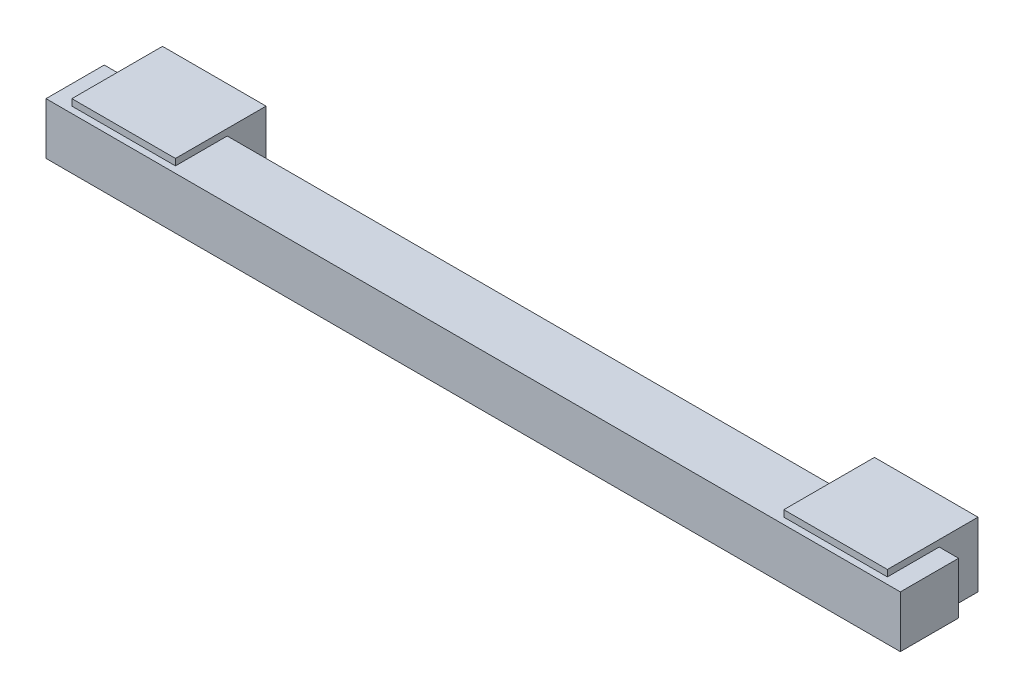
ISO-10303-21;
HEADER;
FILE_DESCRIPTION(('STEP AP214'),'2;1');
FILE_NAME('part.step','',(''),(''),'','','');
FILE_SCHEMA(('AUTOMOTIVE_DESIGN { 1 0 10303 214 1 1 1 1 }'));
ENDSEC;
DATA;
#1=APPLICATION_CONTEXT('core data for automotive mechanical design processes');
#2=APPLICATION_PROTOCOL_DEFINITION('international standard','automotive_design',2000,#1);
#3=PRODUCT_CONTEXT('',#1,'mechanical');
#4=PRODUCT('Part','Part','',(#3));
#5=PRODUCT_RELATED_PRODUCT_CATEGORY('part','',(#4));
#6=PRODUCT_DEFINITION_FORMATION('','',#4);
#7=PRODUCT_DEFINITION_CONTEXT('part definition',#1,'design');
#8=PRODUCT_DEFINITION('design','',#6,#7);
#9=PRODUCT_DEFINITION_SHAPE('','',#8);
#10=(LENGTH_UNIT() NAMED_UNIT(*) SI_UNIT(.MILLI.,.METRE.));
#11=(NAMED_UNIT(*) PLANE_ANGLE_UNIT() SI_UNIT($,.RADIAN.));
#12=(NAMED_UNIT(*) SI_UNIT($,.STERADIAN.) SOLID_ANGLE_UNIT());
#13=UNCERTAINTY_MEASURE_WITH_UNIT(LENGTH_MEASURE(1.E-05),#10,'distance_accuracy_value','');
#14=(GEOMETRIC_REPRESENTATION_CONTEXT(3) GLOBAL_UNCERTAINTY_ASSIGNED_CONTEXT((#13)) GLOBAL_UNIT_ASSIGNED_CONTEXT((#10,
#11,#12)) REPRESENTATION_CONTEXT('',''));
#15=CARTESIAN_POINT('',(0.,0.,0.));
#16=DIRECTION('',(0.,0.,1.));
#17=DIRECTION('',(1.,0.,0.));
#18=AXIS2_PLACEMENT_3D('',#15,#16,#17);
#19=CARTESIAN_POINT('',(0.,0.,15.));
#20=DIRECTION('',(0.,0.,1.));
#21=DIRECTION('',(1.,0.,0.));
#22=AXIS2_PLACEMENT_3D('',#19,#20,#21);
#23=PLANE('',#22);
#24=DIRECTION('',(-1.,0.,0.));
#25=VECTOR('',#24,1.);
#26=CARTESIAN_POINT('',(0.,-4.,15.));
#27=LINE('',#26,#25);
#28=CARTESIAN_POINT('',(66.,-4.,15.));
#29=VERTEX_POINT('',#28);
#30=CARTESIAN_POINT('',(-66.,-4.,15.));
#31=VERTEX_POINT('',#30);
#32=EDGE_CURVE('P0_E11',#29,#31,#27,.T.);
#33=ORIENTED_EDGE('',*,*,#32,.F.);
#34=DIRECTION('',(0.,-1.,0.));
#35=VECTOR('',#34,1.);
#36=CARTESIAN_POINT('',(66.,0.,15.));
#37=LINE('',#36,#35);
#38=CARTESIAN_POINT('',(66.,4.,15.));
#39=VERTEX_POINT('',#38);
#40=EDGE_CURVE('P0_E62',#39,#29,#37,.T.);
#41=ORIENTED_EDGE('',*,*,#40,.F.);
#42=DIRECTION('',(1.,0.,0.));
#43=VECTOR('',#42,1.);
#44=CARTESIAN_POINT('',(0.,4.,15.));
#45=LINE('',#44,#43);
#46=CARTESIAN_POINT('',(-66.,4.,15.));
#47=VERTEX_POINT('',#46);
#48=EDGE_CURVE('P0_E98',#47,#39,#45,.T.);
#49=ORIENTED_EDGE('',*,*,#48,.F.);
#50=DIRECTION('',(0.,1.,0.));
#51=VECTOR('',#50,1.);
#52=CARTESIAN_POINT('',(-66.,0.,15.));
#53=LINE('',#52,#51);
#54=EDGE_CURVE('P0_E25',#31,#47,#53,.T.);
#55=ORIENTED_EDGE('',*,*,#54,.F.);
#56=EDGE_LOOP('',(#33,#41,#49,#55));
#57=FACE_BOUND('',#56,.T.);
#58=ADVANCED_FACE('P0_F17',(#57),#23,.T.);
#59=CARTESIAN_POINT('',(0.,-4.,6.));
#60=DIRECTION('',(0.,-1.,0.));
#61=DIRECTION('',(0.,0.,-1.));
#62=AXIS2_PLACEMENT_3D('',#59,#60,#61);
#63=PLANE('',#62);
#64=DIRECTION('',(0.,0.,1.));
#65=VECTOR('',#64,1.);
#66=CARTESIAN_POINT('',(66.,-4.,6.));
#67=LINE('',#66,#65);
#68=CARTESIAN_POINT('',(66.,-4.,6.));
#69=VERTEX_POINT('',#68);
#70=EDGE_CURVE('P0_E55',#69,#29,#67,.T.);
#71=ORIENTED_EDGE('',*,*,#70,.T.);
#72=ORIENTED_EDGE('',*,*,#32,.T.);
#73=DIRECTION('',(0.,0.,1.));
#74=VECTOR('',#73,1.);
#75=CARTESIAN_POINT('',(-66.,-4.,6.));
#76=LINE('',#75,#74);
#77=CARTESIAN_POINT('',(-66.,-4.,6.));
#78=VERTEX_POINT('',#77);
#79=EDGE_CURVE('P0_E69',#78,#31,#76,.T.);
#80=ORIENTED_EDGE('',*,*,#79,.F.);
#81=DIRECTION('',(1.,0.,0.));
#82=VECTOR('',#81,1.);
#83=CARTESIAN_POINT('',(0.,-4.,6.));
#84=LINE('',#83,#82);
#85=EDGE_CURVE('P0_E67',#78,#69,#84,.T.);
#86=ORIENTED_EDGE('',*,*,#85,.T.);
#87=EDGE_LOOP('',(#71,#72,#80,#86));
#88=FACE_BOUND('',#87,.T.);
#89=ADVANCED_FACE('P0_F68',(#88),#63,.T.);
#90=CARTESIAN_POINT('',(-66.,0.,6.));
#91=DIRECTION('',(-1.,0.,0.));
#92=DIRECTION('',(0.,0.,1.));
#93=AXIS2_PLACEMENT_3D('',#90,#91,#92);
#94=PLANE('',#93);
#95=ORIENTED_EDGE('',*,*,#79,.T.);
#96=ORIENTED_EDGE('',*,*,#54,.T.);
#97=DIRECTION('',(0.,0.,1.));
#98=VECTOR('',#97,1.);
#99=CARTESIAN_POINT('',(-66.,4.,6.));
#100=LINE('',#99,#98);
#101=CARTESIAN_POINT('',(-66.,4.,6.));
#102=VERTEX_POINT('',#101);
#103=EDGE_CURVE('P0_E92',#102,#47,#100,.T.);
#104=ORIENTED_EDGE('',*,*,#103,.F.);
#105=DIRECTION('',(0.,-1.,0.));
#106=VECTOR('',#105,1.);
#107=CARTESIAN_POINT('',(-66.,0.,6.));
#108=LINE('',#107,#106);
#109=EDGE_CURVE('P0_E74',#102,#78,#108,.T.);
#110=ORIENTED_EDGE('',*,*,#109,.T.);
#111=EDGE_LOOP('',(#95,#96,#104,#110));
#112=FACE_BOUND('',#111,.T.);
#113=ADVANCED_FACE('P0_F106',(#112),#94,.T.);
#114=CARTESIAN_POINT('',(0.,4.,6.));
#115=DIRECTION('',(0.,1.,0.));
#116=DIRECTION('',(0.,0.,1.));
#117=AXIS2_PLACEMENT_3D('',#114,#115,#116);
#118=PLANE('',#117);
#119=ORIENTED_EDGE('',*,*,#103,.T.);
#120=ORIENTED_EDGE('',*,*,#48,.T.);
#121=DIRECTION('',(0.,0.,1.));
#122=VECTOR('',#121,1.);
#123=CARTESIAN_POINT('',(66.,4.,6.));
#124=LINE('',#123,#122);
#125=CARTESIAN_POINT('',(66.,4.,6.));
#126=VERTEX_POINT('',#125);
#127=EDGE_CURVE('P0_E64',#126,#39,#124,.T.);
#128=ORIENTED_EDGE('',*,*,#127,.F.);
#129=DIRECTION('',(-1.,0.,0.));
#130=VECTOR('',#129,1.);
#131=CARTESIAN_POINT('',(0.,4.,6.));
#132=LINE('',#131,#130);
#133=EDGE_CURVE('P0_E79',#126,#102,#132,.T.);
#134=ORIENTED_EDGE('',*,*,#133,.T.);
#135=EDGE_LOOP('',(#119,#120,#128,#134));
#136=FACE_BOUND('',#135,.T.);
#137=ADVANCED_FACE('P0_F104',(#136),#118,.T.);
#138=CARTESIAN_POINT('',(0.,0.,6.));
#139=DIRECTION('',(0.,0.,-1.));
#140=DIRECTION('',(-1.,0.,0.));
#141=AXIS2_PLACEMENT_3D('',#138,#139,#140);
#142=PLANE('',#141);
#143=DIRECTION('',(0.,1.,0.));
#144=VECTOR('',#143,1.);
#145=CARTESIAN_POINT('',(66.,0.,6.));
#146=LINE('',#145,#144);
#147=EDGE_CURVE('P0_E60',#69,#126,#146,.T.);
#148=ORIENTED_EDGE('',*,*,#147,.F.);
#149=ORIENTED_EDGE('',*,*,#85,.F.);
#150=ORIENTED_EDGE('',*,*,#109,.F.);
#151=ORIENTED_EDGE('',*,*,#133,.F.);
#152=EDGE_LOOP('',(#148,#149,#150,#151));
#153=FACE_BOUND('',#152,.T.);
#154=ADVANCED_FACE('P0_F77',(#153),#142,.T.);
#155=CARTESIAN_POINT('',(66.,0.,6.));
#156=DIRECTION('',(1.,0.,0.));
#157=DIRECTION('',(0.,0.,-1.));
#158=AXIS2_PLACEMENT_3D('',#155,#156,#157);
#159=PLANE('',#158);
#160=ORIENTED_EDGE('',*,*,#147,.T.);
#161=ORIENTED_EDGE('',*,*,#127,.T.);
#162=ORIENTED_EDGE('',*,*,#40,.T.);
#163=ORIENTED_EDGE('',*,*,#70,.F.);
#164=EDGE_LOOP('',(#160,#161,#162,#163));
#165=FACE_BOUND('',#164,.T.);
#166=ADVANCED_FACE('P0_F57',(#165),#159,.T.);
#167=CLOSED_SHELL('',(#58,#89,#113,#137,#154,#166));
#168=MANIFOLD_SOLID_BREP('P0_B1',#167);
#169=CARTESIAN_POINT('',(-55.,0.,14.));
#170=DIRECTION('',(0.,0.,1.));
#171=DIRECTION('',(1.,0.,0.));
#172=AXIS2_PLACEMENT_3D('',#169,#170,#171);
#173=PLANE('',#172);
#174=DIRECTION('',(-1.,0.,0.));
#175=VECTOR('',#174,1.);
#176=CARTESIAN_POINT('',(-55.,-5.,14.));
#177=LINE('',#176,#175);
#178=CARTESIAN_POINT('',(-47.,-5.,14.));
#179=VERTEX_POINT('',#178);
#180=CARTESIAN_POINT('',(-63.,-5.,14.));
#181=VERTEX_POINT('',#180);
#182=EDGE_CURVE('P1_E11',#179,#181,#177,.T.);
#183=ORIENTED_EDGE('',*,*,#182,.F.);
#184=DIRECTION('',(0.,-1.,0.));
#185=VECTOR('',#184,1.);
#186=CARTESIAN_POINT('',(-47.,0.,14.));
#187=LINE('',#186,#185);
#188=CARTESIAN_POINT('',(-47.,5.,14.));
#189=VERTEX_POINT('',#188);
#190=EDGE_CURVE('P1_E62',#189,#179,#187,.T.);
#191=ORIENTED_EDGE('',*,*,#190,.F.);
#192=DIRECTION('',(1.,0.,0.));
#193=VECTOR('',#192,1.);
#194=CARTESIAN_POINT('',(-55.,5.,14.));
#195=LINE('',#194,#193);
#196=CARTESIAN_POINT('',(-63.,5.,14.));
#197=VERTEX_POINT('',#196);
#198=EDGE_CURVE('P1_E98',#197,#189,#195,.T.);
#199=ORIENTED_EDGE('',*,*,#198,.F.);
#200=DIRECTION('',(0.,1.,0.));
#201=VECTOR('',#200,1.);
#202=CARTESIAN_POINT('',(-63.,0.,14.));
#203=LINE('',#202,#201);
#204=EDGE_CURVE('P1_E25',#181,#197,#203,.T.);
#205=ORIENTED_EDGE('',*,*,#204,.F.);
#206=EDGE_LOOP('',(#183,#191,#199,#205));
#207=FACE_BOUND('',#206,.T.);
#208=ADVANCED_FACE('P1_F17',(#207),#173,.T.);
#209=CARTESIAN_POINT('',(-55.,-5.,0.));
#210=DIRECTION('',(0.,-1.,0.));
#211=DIRECTION('',(0.,0.,-1.));
#212=AXIS2_PLACEMENT_3D('',#209,#210,#211);
#213=PLANE('',#212);
#214=DIRECTION('',(0.,0.,1.));
#215=VECTOR('',#214,1.);
#216=CARTESIAN_POINT('',(-47.,-5.,0.));
#217=LINE('',#216,#215);
#218=CARTESIAN_POINT('',(-47.,-5.,0.));
#219=VERTEX_POINT('',#218);
#220=EDGE_CURVE('P1_E55',#219,#179,#217,.T.);
#221=ORIENTED_EDGE('',*,*,#220,.T.);
#222=ORIENTED_EDGE('',*,*,#182,.T.);
#223=DIRECTION('',(0.,0.,1.));
#224=VECTOR('',#223,1.);
#225=CARTESIAN_POINT('',(-63.,-5.,0.));
#226=LINE('',#225,#224);
#227=CARTESIAN_POINT('',(-63.,-5.,0.));
#228=VERTEX_POINT('',#227);
#229=EDGE_CURVE('P1_E69',#228,#181,#226,.T.);
#230=ORIENTED_EDGE('',*,*,#229,.F.);
#231=DIRECTION('',(1.,0.,0.));
#232=VECTOR('',#231,1.);
#233=CARTESIAN_POINT('',(-55.,-5.,0.));
#234=LINE('',#233,#232);
#235=EDGE_CURVE('P1_E67',#228,#219,#234,.T.);
#236=ORIENTED_EDGE('',*,*,#235,.T.);
#237=EDGE_LOOP('',(#221,#222,#230,#236));
#238=FACE_BOUND('',#237,.T.);
#239=ADVANCED_FACE('P1_F68',(#238),#213,.T.);
#240=CARTESIAN_POINT('',(-63.,0.,0.));
#241=DIRECTION('',(-1.,0.,0.));
#242=DIRECTION('',(0.,0.,1.));
#243=AXIS2_PLACEMENT_3D('',#240,#241,#242);
#244=PLANE('',#243);
#245=ORIENTED_EDGE('',*,*,#229,.T.);
#246=ORIENTED_EDGE('',*,*,#204,.T.);
#247=DIRECTION('',(0.,0.,1.));
#248=VECTOR('',#247,1.);
#249=CARTESIAN_POINT('',(-63.,5.,0.));
#250=LINE('',#249,#248);
#251=CARTESIAN_POINT('',(-63.,5.,0.));
#252=VERTEX_POINT('',#251);
#253=EDGE_CURVE('P1_E91',#252,#197,#250,.T.);
#254=ORIENTED_EDGE('',*,*,#253,.F.);
#255=DIRECTION('',(0.,-1.,0.));
#256=VECTOR('',#255,1.);
#257=CARTESIAN_POINT('',(-63.,0.,0.));
#258=LINE('',#257,#256);
#259=EDGE_CURVE('P1_E74',#252,#228,#258,.T.);
#260=ORIENTED_EDGE('',*,*,#259,.T.);
#261=EDGE_LOOP('',(#245,#246,#254,#260));
#262=FACE_BOUND('',#261,.T.);
#263=ADVANCED_FACE('P1_F106',(#262),#244,.T.);
#264=CARTESIAN_POINT('',(-55.,5.,0.));
#265=DIRECTION('',(0.,1.,0.));
#266=DIRECTION('',(0.,0.,1.));
#267=AXIS2_PLACEMENT_3D('',#264,#265,#266);
#268=PLANE('',#267);
#269=ORIENTED_EDGE('',*,*,#253,.T.);
#270=ORIENTED_EDGE('',*,*,#198,.T.);
#271=DIRECTION('',(0.,0.,1.));
#272=VECTOR('',#271,1.);
#273=CARTESIAN_POINT('',(-47.,5.,0.));
#274=LINE('',#273,#272);
#275=CARTESIAN_POINT('',(-47.,5.,0.));
#276=VERTEX_POINT('',#275);
#277=EDGE_CURVE('P1_E64',#276,#189,#274,.T.);
#278=ORIENTED_EDGE('',*,*,#277,.F.);
#279=DIRECTION('',(-1.,0.,0.));
#280=VECTOR('',#279,1.);
#281=CARTESIAN_POINT('',(-55.,5.,0.));
#282=LINE('',#281,#280);
#283=EDGE_CURVE('P1_E79',#276,#252,#282,.T.);
#284=ORIENTED_EDGE('',*,*,#283,.T.);
#285=EDGE_LOOP('',(#269,#270,#278,#284));
#286=FACE_BOUND('',#285,.T.);
#287=ADVANCED_FACE('P1_F104',(#286),#268,.T.);
#288=CARTESIAN_POINT('',(-55.,0.,0.));
#289=DIRECTION('',(0.,0.,-1.));
#290=DIRECTION('',(-1.,0.,0.));
#291=AXIS2_PLACEMENT_3D('',#288,#289,#290);
#292=PLANE('',#291);
#293=DIRECTION('',(0.,1.,0.));
#294=VECTOR('',#293,1.);
#295=CARTESIAN_POINT('',(-47.,0.,0.));
#296=LINE('',#295,#294);
#297=EDGE_CURVE('P1_E60',#219,#276,#296,.T.);
#298=ORIENTED_EDGE('',*,*,#297,.F.);
#299=ORIENTED_EDGE('',*,*,#235,.F.);
#300=ORIENTED_EDGE('',*,*,#259,.F.);
#301=ORIENTED_EDGE('',*,*,#283,.F.);
#302=EDGE_LOOP('',(#298,#299,#300,#301));
#303=FACE_BOUND('',#302,.T.);
#304=ADVANCED_FACE('P1_F77',(#303),#292,.T.);
#305=CARTESIAN_POINT('',(-47.,0.,0.));
#306=DIRECTION('',(1.,0.,0.));
#307=DIRECTION('',(0.,0.,-1.));
#308=AXIS2_PLACEMENT_3D('',#305,#306,#307);
#309=PLANE('',#308);
#310=ORIENTED_EDGE('',*,*,#297,.T.);
#311=ORIENTED_EDGE('',*,*,#277,.T.);
#312=ORIENTED_EDGE('',*,*,#190,.T.);
#313=ORIENTED_EDGE('',*,*,#220,.F.);
#314=EDGE_LOOP('',(#310,#311,#312,#313));
#315=FACE_BOUND('',#314,.T.);
#316=ADVANCED_FACE('P1_F57',(#315),#309,.T.);
#317=CLOSED_SHELL('',(#208,#239,#263,#287,#304,#316));
#318=MANIFOLD_SOLID_BREP('P1_B1',#317);
#319=CARTESIAN_POINT('',(55.,0.,14.));
#320=DIRECTION('',(0.,0.,1.));
#321=DIRECTION('',(1.,0.,0.));
#322=AXIS2_PLACEMENT_3D('',#319,#320,#321);
#323=PLANE('',#322);
#324=DIRECTION('',(-1.,0.,0.));
#325=VECTOR('',#324,1.);
#326=CARTESIAN_POINT('',(55.,-5.,14.));
#327=LINE('',#326,#325);
#328=CARTESIAN_POINT('',(63.,-5.,14.));
#329=VERTEX_POINT('',#328);
#330=CARTESIAN_POINT('',(47.,-5.,14.));
#331=VERTEX_POINT('',#330);
#332=EDGE_CURVE('P2_E11',#329,#331,#327,.T.);
#333=ORIENTED_EDGE('',*,*,#332,.F.);
#334=DIRECTION('',(0.,-1.,0.));
#335=VECTOR('',#334,1.);
#336=CARTESIAN_POINT('',(63.,0.,14.));
#337=LINE('',#336,#335);
#338=CARTESIAN_POINT('',(63.,5.,14.));
#339=VERTEX_POINT('',#338);
#340=EDGE_CURVE('P2_E62',#339,#329,#337,.T.);
#341=ORIENTED_EDGE('',*,*,#340,.F.);
#342=DIRECTION('',(1.,0.,0.));
#343=VECTOR('',#342,1.);
#344=CARTESIAN_POINT('',(55.,5.,14.));
#345=LINE('',#344,#343);
#346=CARTESIAN_POINT('',(47.,5.,14.));
#347=VERTEX_POINT('',#346);
#348=EDGE_CURVE('P2_E98',#347,#339,#345,.T.);
#349=ORIENTED_EDGE('',*,*,#348,.F.);
#350=DIRECTION('',(0.,1.,0.));
#351=VECTOR('',#350,1.);
#352=CARTESIAN_POINT('',(47.,0.,14.));
#353=LINE('',#352,#351);
#354=EDGE_CURVE('P2_E25',#331,#347,#353,.T.);
#355=ORIENTED_EDGE('',*,*,#354,.F.);
#356=EDGE_LOOP('',(#333,#341,#349,#355));
#357=FACE_BOUND('',#356,.T.);
#358=ADVANCED_FACE('P2_F17',(#357),#323,.T.);
#359=CARTESIAN_POINT('',(55.,-5.,0.));
#360=DIRECTION('',(0.,-1.,0.));
#361=DIRECTION('',(0.,0.,-1.));
#362=AXIS2_PLACEMENT_3D('',#359,#360,#361);
#363=PLANE('',#362);
#364=DIRECTION('',(0.,0.,1.));
#365=VECTOR('',#364,1.);
#366=CARTESIAN_POINT('',(63.,-5.,0.));
#367=LINE('',#366,#365);
#368=CARTESIAN_POINT('',(63.,-5.,0.));
#369=VERTEX_POINT('',#368);
#370=EDGE_CURVE('P2_E55',#369,#329,#367,.T.);
#371=ORIENTED_EDGE('',*,*,#370,.T.);
#372=ORIENTED_EDGE('',*,*,#332,.T.);
#373=DIRECTION('',(0.,0.,1.));
#374=VECTOR('',#373,1.);
#375=CARTESIAN_POINT('',(47.,-5.,0.));
#376=LINE('',#375,#374);
#377=CARTESIAN_POINT('',(47.,-5.,0.));
#378=VERTEX_POINT('',#377);
#379=EDGE_CURVE('P2_E69',#378,#331,#376,.T.);
#380=ORIENTED_EDGE('',*,*,#379,.F.);
#381=DIRECTION('',(1.,0.,0.));
#382=VECTOR('',#381,1.);
#383=CARTESIAN_POINT('',(55.,-5.,0.));
#384=LINE('',#383,#382);
#385=EDGE_CURVE('P2_E67',#378,#369,#384,.T.);
#386=ORIENTED_EDGE('',*,*,#385,.T.);
#387=EDGE_LOOP('',(#371,#372,#380,#386));
#388=FACE_BOUND('',#387,.T.);
#389=ADVANCED_FACE('P2_F68',(#388),#363,.T.);
#390=CARTESIAN_POINT('',(47.,0.,0.));
#391=DIRECTION('',(-1.,0.,0.));
#392=DIRECTION('',(0.,0.,1.));
#393=AXIS2_PLACEMENT_3D('',#390,#391,#392);
#394=PLANE('',#393);
#395=ORIENTED_EDGE('',*,*,#379,.T.);
#396=ORIENTED_EDGE('',*,*,#354,.T.);
#397=DIRECTION('',(0.,0.,1.));
#398=VECTOR('',#397,1.);
#399=CARTESIAN_POINT('',(47.,5.,0.));
#400=LINE('',#399,#398);
#401=CARTESIAN_POINT('',(47.,5.,0.));
#402=VERTEX_POINT('',#401);
#403=EDGE_CURVE('P2_E90',#402,#347,#400,.T.);
#404=ORIENTED_EDGE('',*,*,#403,.F.);
#405=DIRECTION('',(0.,-1.,0.));
#406=VECTOR('',#405,1.);
#407=CARTESIAN_POINT('',(47.,0.,0.));
#408=LINE('',#407,#406);
#409=EDGE_CURVE('P2_E74',#402,#378,#408,.T.);
#410=ORIENTED_EDGE('',*,*,#409,.T.);
#411=EDGE_LOOP('',(#395,#396,#404,#410));
#412=FACE_BOUND('',#411,.T.);
#413=ADVANCED_FACE('P2_F106',(#412),#394,.T.);
#414=CARTESIAN_POINT('',(55.,5.,0.));
#415=DIRECTION('',(0.,1.,0.));
#416=DIRECTION('',(0.,0.,1.));
#417=AXIS2_PLACEMENT_3D('',#414,#415,#416);
#418=PLANE('',#417);
#419=ORIENTED_EDGE('',*,*,#403,.T.);
#420=ORIENTED_EDGE('',*,*,#348,.T.);
#421=DIRECTION('',(0.,0.,1.));
#422=VECTOR('',#421,1.);
#423=CARTESIAN_POINT('',(63.,5.,0.));
#424=LINE('',#423,#422);
#425=CARTESIAN_POINT('',(63.,5.,0.));
#426=VERTEX_POINT('',#425);
#427=EDGE_CURVE('P2_E64',#426,#339,#424,.T.);
#428=ORIENTED_EDGE('',*,*,#427,.F.);
#429=DIRECTION('',(-1.,0.,0.));
#430=VECTOR('',#429,1.);
#431=CARTESIAN_POINT('',(55.,5.,0.));
#432=LINE('',#431,#430);
#433=EDGE_CURVE('P2_E79',#426,#402,#432,.T.);
#434=ORIENTED_EDGE('',*,*,#433,.T.);
#435=EDGE_LOOP('',(#419,#420,#428,#434));
#436=FACE_BOUND('',#435,.T.);
#437=ADVANCED_FACE('P2_F104',(#436),#418,.T.);
#438=CARTESIAN_POINT('',(55.,0.,0.));
#439=DIRECTION('',(0.,0.,-1.));
#440=DIRECTION('',(-1.,0.,0.));
#441=AXIS2_PLACEMENT_3D('',#438,#439,#440);
#442=PLANE('',#441);
#443=DIRECTION('',(0.,1.,0.));
#444=VECTOR('',#443,1.);
#445=CARTESIAN_POINT('',(63.,0.,0.));
#446=LINE('',#445,#444);
#447=EDGE_CURVE('P2_E60',#369,#426,#446,.T.);
#448=ORIENTED_EDGE('',*,*,#447,.F.);
#449=ORIENTED_EDGE('',*,*,#385,.F.);
#450=ORIENTED_EDGE('',*,*,#409,.F.);
#451=ORIENTED_EDGE('',*,*,#433,.F.);
#452=EDGE_LOOP('',(#448,#449,#450,#451));
#453=FACE_BOUND('',#452,.T.);
#454=ADVANCED_FACE('P2_F77',(#453),#442,.T.);
#455=CARTESIAN_POINT('',(63.,0.,0.));
#456=DIRECTION('',(1.,0.,0.));
#457=DIRECTION('',(0.,0.,-1.));
#458=AXIS2_PLACEMENT_3D('',#455,#456,#457);
#459=PLANE('',#458);
#460=ORIENTED_EDGE('',*,*,#447,.T.);
#461=ORIENTED_EDGE('',*,*,#427,.T.);
#462=ORIENTED_EDGE('',*,*,#340,.T.);
#463=ORIENTED_EDGE('',*,*,#370,.F.);
#464=EDGE_LOOP('',(#460,#461,#462,#463));
#465=FACE_BOUND('',#464,.T.);
#466=ADVANCED_FACE('P2_F57',(#465),#459,.T.);
#467=CLOSED_SHELL('',(#358,#389,#413,#437,#454,#466));
#468=MANIFOLD_SOLID_BREP('P2_B1',#467);
#469=ADVANCED_BREP_SHAPE_REPRESENTATION('',(#18,#168,#318,#468),#14);
#470=SHAPE_DEFINITION_REPRESENTATION(#9,#469);
ENDSEC;
END-ISO-10303-21;
